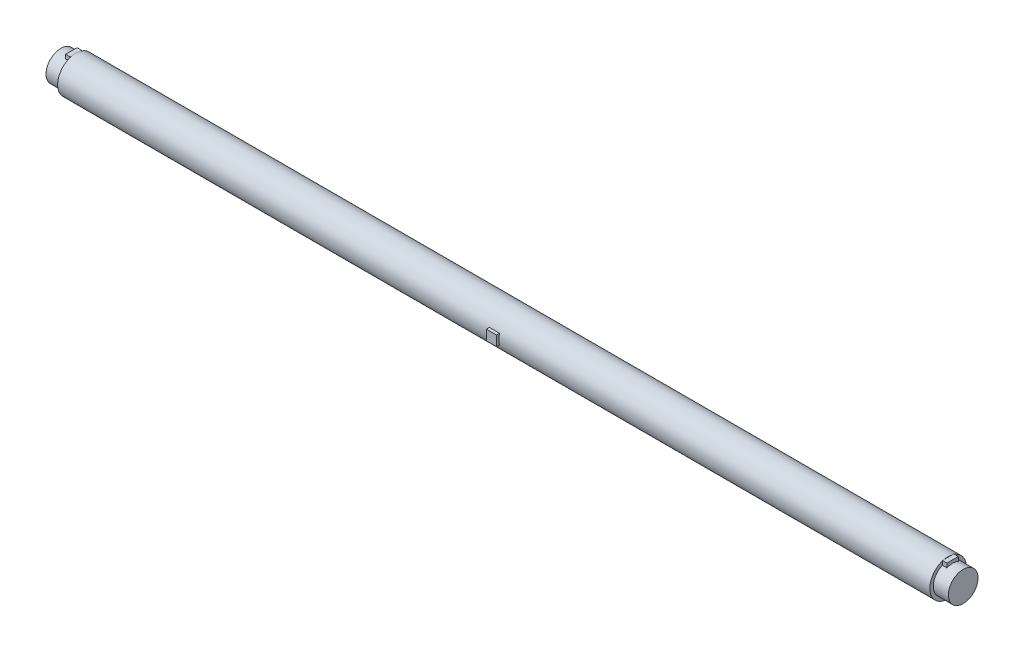
ISO-10303-21;
HEADER;
FILE_DESCRIPTION(('STEP AP214'),'2;1');
FILE_NAME('part.step','',(''),(''),'','','');
FILE_SCHEMA(('AUTOMOTIVE_DESIGN { 1 0 10303 214 1 1 1 1 }'));
ENDSEC;
DATA;
#1=APPLICATION_CONTEXT('core data for automotive mechanical design processes');
#2=APPLICATION_PROTOCOL_DEFINITION('international standard','automotive_design',2000,#1);
#3=PRODUCT_CONTEXT('',#1,'mechanical');
#4=PRODUCT('Part','Part','',(#3));
#5=PRODUCT_RELATED_PRODUCT_CATEGORY('part','',(#4));
#6=PRODUCT_DEFINITION_FORMATION('','',#4);
#7=PRODUCT_DEFINITION_CONTEXT('part definition',#1,'design');
#8=PRODUCT_DEFINITION('design','',#6,#7);
#9=PRODUCT_DEFINITION_SHAPE('','',#8);
#10=(LENGTH_UNIT() NAMED_UNIT(*) SI_UNIT(.MILLI.,.METRE.));
#11=(NAMED_UNIT(*) PLANE_ANGLE_UNIT() SI_UNIT($,.RADIAN.));
#12=(NAMED_UNIT(*) SI_UNIT($,.STERADIAN.) SOLID_ANGLE_UNIT());
#13=UNCERTAINTY_MEASURE_WITH_UNIT(LENGTH_MEASURE(1.E-05),#10,'distance_accuracy_value','');
#14=(GEOMETRIC_REPRESENTATION_CONTEXT(3) GLOBAL_UNCERTAINTY_ASSIGNED_CONTEXT((#13)) GLOBAL_UNIT_ASSIGNED_CONTEXT((#10,
#11,#12)) REPRESENTATION_CONTEXT('',''));
#15=CARTESIAN_POINT('',(0.,0.,0.));
#16=DIRECTION('',(0.,0.,1.));
#17=DIRECTION('',(1.,0.,0.));
#18=AXIS2_PLACEMENT_3D('',#15,#16,#17);
#19=CARTESIAN_POINT('',(955.,40.,0.));
#20=DIRECTION('',(1.,0.,0.));
#21=DIRECTION('',(0.,1.,0.));
#22=AXIS2_PLACEMENT_3D('',#19,#20,#21);
#23=PLANE('',#22);
#24=DIRECTION('',(0.,1.,0.));
#25=VECTOR('',#24,1.);
#26=CARTESIAN_POINT('',(955.,30.0000000000002,12.5));
#27=LINE('',#26,#25);
#28=CARTESIAN_POINT('',(955.,30.0000000000002,12.5));
#29=VERTEX_POINT('',#28);
#30=CARTESIAN_POINT('',(955.,37.9967103839266,12.5));
#31=VERTEX_POINT('',#30);
#32=EDGE_CURVE('E191',#29,#31,#27,.T.);
#33=ORIENTED_EDGE('',*,*,#32,.T.);
#34=CARTESIAN_POINT('',(955.,2.37948873074331E-13,0.));
#35=DIRECTION('',(1.,0.,0.));
#36=DIRECTION('',(0.,1.,0.));
#37=AXIS2_PLACEMENT_3D('',#34,#35,#36);
#38=CIRCLE('',#37,39.9999999999998);
#39=CARTESIAN_POINT('',(955.,37.9967103839266,-12.5));
#40=VERTEX_POINT('',#39);
#41=EDGE_CURVE('E309',#31,#40,#38,.T.);
#42=ORIENTED_EDGE('',*,*,#41,.T.);
#43=DIRECTION('',(0.,-1.,0.));
#44=VECTOR('',#43,1.);
#45=CARTESIAN_POINT('',(955.,30.0000000000002,-12.5));
#46=LINE('',#45,#44);
#47=CARTESIAN_POINT('',(955.,30.0000000000002,-12.5));
#48=VERTEX_POINT('',#47);
#49=EDGE_CURVE('E194',#40,#48,#46,.T.);
#50=ORIENTED_EDGE('',*,*,#49,.T.);
#51=CARTESIAN_POINT('',(955.,2.37948873074331E-13,0.));
#52=DIRECTION('',(1.,0.,0.));
#53=DIRECTION('',(0.,1.,0.));
#54=AXIS2_PLACEMENT_3D('',#51,#52,#53);
#55=CIRCLE('',#54,32.5);
#56=EDGE_CURVE('E161',#29,#48,#55,.T.);
#57=ORIENTED_EDGE('',*,*,#56,.F.);
#58=EDGE_LOOP('',(#33,#42,#50,#57));
#59=FACE_BOUND('',#58,.T.);
#60=ADVANCED_FACE('F39',(#59),#23,.T.);
#61=CARTESIAN_POINT('',(988.,2.41990207511517E-13,0.));
#62=DIRECTION('',(1.,0.,0.));
#63=DIRECTION('',(0.,1.,0.));
#64=AXIS2_PLACEMENT_3D('',#61,#62,#63);
#65=CYLINDRICAL_SURFACE('',#64,32.5);
#66=CARTESIAN_POINT('',(-988.,0.,0.));
#67=DIRECTION('',(1.,0.,0.));
#68=DIRECTION('',(0.,1.,0.));
#69=AXIS2_PLACEMENT_3D('',#66,#67,#68);
#70=CIRCLE('',#69,32.5);
#71=CARTESIAN_POINT('',(-988.,32.5,0.));
#72=VERTEX_POINT('',#71);
#73=EDGE_CURVE('E11',#72,#72,#70,.T.);
#74=ORIENTED_EDGE('',*,*,#73,.T.);
#75=EDGE_LOOP('',(#74));
#76=FACE_BOUND('',#75,.T.);
#77=CARTESIAN_POINT('',(-955.,0.,0.));
#78=DIRECTION('',(1.,0.,0.));
#79=DIRECTION('',(0.,1.,0.));
#80=AXIS2_PLACEMENT_3D('',#77,#78,#79);
#81=CIRCLE('',#80,32.5);
#82=CARTESIAN_POINT('',(-955.,30.,12.5));
#83=VERTEX_POINT('',#82);
#84=CARTESIAN_POINT('',(-955.,30.,-12.5));
#85=VERTEX_POINT('',#84);
#86=EDGE_CURVE('E48',#83,#85,#81,.T.);
#87=ORIENTED_EDGE('',*,*,#86,.F.);
#88=DIRECTION('',(1.,0.,0.));
#89=VECTOR('',#88,1.);
#90=CARTESIAN_POINT('',(-965.,30.,12.5));
#91=LINE('',#90,#89);
#92=CARTESIAN_POINT('',(-965.,30.,12.5));
#93=VERTEX_POINT('',#92);
#94=EDGE_CURVE('E229',#93,#83,#91,.T.);
#95=ORIENTED_EDGE('',*,*,#94,.F.);
#96=CARTESIAN_POINT('',(-965.,0.,0.));
#97=DIRECTION('',(1.,0.,0.));
#98=DIRECTION('',(0.,-1.,0.));
#99=AXIS2_PLACEMENT_3D('',#96,#97,#98);
#100=CIRCLE('',#99,32.5);
#101=CARTESIAN_POINT('',(-965.,30.,-12.5));
#102=VERTEX_POINT('',#101);
#103=EDGE_CURVE('E226',#102,#93,#100,.T.);
#104=ORIENTED_EDGE('',*,*,#103,.F.);
#105=DIRECTION('',(1.,0.,0.));
#106=VECTOR('',#105,1.);
#107=CARTESIAN_POINT('',(-965.,30.,-12.5));
#108=LINE('',#107,#106);
#109=EDGE_CURVE('E245',#102,#85,#108,.T.);
#110=ORIENTED_EDGE('',*,*,#109,.T.);
#111=EDGE_LOOP('',(#87,#95,#104,#110));
#112=FACE_BOUND('',#111,.T.);
#113=ADVANCED_FACE('F325',(#76,#112),#65,.T.);
#114=CARTESIAN_POINT('',(-955.,32.5,0.));
#115=DIRECTION('',(-1.,0.,0.));
#116=DIRECTION('',(0.,-1.,0.));
#117=AXIS2_PLACEMENT_3D('',#114,#115,#116);
#118=PLANE('',#117);
#119=CARTESIAN_POINT('',(-955.,0.,0.));
#120=DIRECTION('',(1.,0.,0.));
#121=DIRECTION('',(0.,1.,0.));
#122=AXIS2_PLACEMENT_3D('',#119,#120,#121);
#123=CIRCLE('',#122,40.);
#124=CARTESIAN_POINT('',(-955.,37.9967103839266,12.5));
#125=VERTEX_POINT('',#124);
#126=CARTESIAN_POINT('',(-955.,37.9967103839265,-12.5));
#127=VERTEX_POINT('',#126);
#128=EDGE_CURVE('E313',#125,#127,#123,.T.);
#129=ORIENTED_EDGE('',*,*,#128,.F.);
#130=DIRECTION('',(0.,1.,0.));
#131=VECTOR('',#130,1.);
#132=CARTESIAN_POINT('',(-955.,30.,12.5));
#133=LINE('',#132,#131);
#134=EDGE_CURVE('E230',#83,#125,#133,.T.);
#135=ORIENTED_EDGE('',*,*,#134,.F.);
#136=ORIENTED_EDGE('',*,*,#86,.T.);
#137=DIRECTION('',(0.,-1.,0.));
#138=VECTOR('',#137,1.);
#139=CARTESIAN_POINT('',(-955.,30.,-12.5));
#140=LINE('',#139,#138);
#141=EDGE_CURVE('E238',#127,#85,#140,.T.);
#142=ORIENTED_EDGE('',*,*,#141,.F.);
#143=EDGE_LOOP('',(#129,#135,#136,#142));
#144=FACE_BOUND('',#143,.T.);
#145=ADVANCED_FACE('F321',(#144),#118,.T.);
#146=CARTESIAN_POINT('',(-955.,39.13,-8.29717421776783));
#147=VERTEX_POINT('',#146);
#148=CARTESIAN_POINT('',(-955.,39.13,8.29717421776783));
#149=VERTEX_POINT('',#148);
#150=EDGE_CURVE('E308',#147,#149,#123,.T.);
#151=ORIENTED_EDGE('',*,*,#150,.F.);
#152=DIRECTION('',(0.,0.,-1.));
#153=VECTOR('',#152,1.);
#154=CARTESIAN_POINT('',(-955.,39.13,-12.5));
#155=LINE('',#154,#153);
#156=EDGE_CURVE('E239',#149,#147,#155,.T.);
#157=ORIENTED_EDGE('',*,*,#156,.F.);
#158=EDGE_LOOP('',(#151,#157));
#159=FACE_BOUND('',#158,.T.);
#160=ADVANCED_FACE('F383',(#159),#118,.T.);
#161=CARTESIAN_POINT('',(-988.,0.,0.));
#162=DIRECTION('',(-1.,0.,0.));
#163=DIRECTION('',(0.,-1.,0.));
#164=AXIS2_PLACEMENT_3D('',#161,#162,#163);
#165=PLANE('',#164);
#166=ORIENTED_EDGE('',*,*,#73,.F.);
#167=EDGE_LOOP('',(#166));
#168=FACE_BOUND('',#167,.T.);
#169=ADVANCED_FACE('F41',(#168),#165,.T.);
#170=CARTESIAN_POINT('',(988.,2.41990207511517E-13,0.));
#171=DIRECTION('',(1.,0.,0.));
#172=DIRECTION('',(0.,1.,0.));
#173=AXIS2_PLACEMENT_3D('',#170,#171,#172);
#174=CYLINDRICAL_SURFACE('',#173,39.9999999999999);
#175=DIRECTION('',(1.,0.,0.));
#176=VECTOR('',#175,1.);
#177=CARTESIAN_POINT('',(988.,-11.,38.4577690460586));
#178=LINE('',#177,#176);
#179=CARTESIAN_POINT('',(11.18,-11.,38.4577690460587));
#180=VERTEX_POINT('',#179);
#181=CARTESIAN_POINT('',(-11.18,-11.0000000000001,38.4577690460586));
#182=VERTEX_POINT('',#181);
#183=EDGE_CURVE('E268',#180,#182,#178,.F.);
#184=ORIENTED_EDGE('',*,*,#183,.T.);
#185=CARTESIAN_POINT('',(-11.18,1.19625948634312E-13,0.));
#186=DIRECTION('',(-1.,0.,0.));
#187=DIRECTION('',(0.,-1.,0.));
#188=AXIS2_PLACEMENT_3D('',#185,#186,#187);
#189=CIRCLE('',#188,39.9999999999999);
#190=CARTESIAN_POINT('',(-11.18,10.9999999999999,38.4577690460588));
#191=VERTEX_POINT('',#190);
#192=EDGE_CURVE('E265',#182,#191,#189,.T.);
#193=ORIENTED_EDGE('',*,*,#192,.T.);
#194=DIRECTION('',(1.,0.,0.));
#195=VECTOR('',#194,1.);
#196=CARTESIAN_POINT('',(988.,11.,38.4577690460588));
#197=LINE('',#196,#195);
#198=CARTESIAN_POINT('',(11.18,10.9999999999999,38.4577690460588));
#199=VERTEX_POINT('',#198);
#200=EDGE_CURVE('E261',#191,#199,#197,.T.);
#201=ORIENTED_EDGE('',*,*,#200,.T.);
#202=CARTESIAN_POINT('',(11.18,1.22364258877205E-13,0.));
#203=DIRECTION('',(1.,0.,0.));
#204=DIRECTION('',(0.,0.,-1.));
#205=AXIS2_PLACEMENT_3D('',#202,#203,#204);
#206=CIRCLE('',#205,39.9999999999999);
#207=EDGE_CURVE('E258',#199,#180,#206,.T.);
#208=ORIENTED_EDGE('',*,*,#207,.T.);
#209=EDGE_LOOP('',(#184,#193,#201,#208));
#210=FACE_BOUND('',#209,.T.);
#211=EDGE_CURVE('E310',#149,#125,#123,.T.);
#212=ORIENTED_EDGE('',*,*,#211,.T.);
#213=ORIENTED_EDGE('',*,*,#128,.T.);
#214=EDGE_CURVE('E398',#127,#147,#123,.T.);
#215=ORIENTED_EDGE('',*,*,#214,.T.);
#216=ORIENTED_EDGE('',*,*,#150,.T.);
#217=EDGE_LOOP('',(#212,#213,#215,#216));
#218=FACE_BOUND('',#217,.T.);
#219=CARTESIAN_POINT('',(955.,39.1300000000002,8.29717421776724));
#220=VERTEX_POINT('',#219);
#221=EDGE_CURVE('E304',#220,#31,#38,.T.);
#222=ORIENTED_EDGE('',*,*,#221,.F.);
#223=CARTESIAN_POINT('',(955.,39.1300000000002,-8.29717421776724));
#224=VERTEX_POINT('',#223);
#225=EDGE_CURVE('E303',#224,#220,#38,.T.);
#226=ORIENTED_EDGE('',*,*,#225,.F.);
#227=CARTESIAN_POINT('',(955.,2.37948873074331E-13,0.));
#228=DIRECTION('',(1.,0.,0.));
#229=DIRECTION('',(0.,1.,0.));
#230=AXIS2_PLACEMENT_3D('',#227,#228,#229);
#231=CIRCLE('',#230,39.9999999999999);
#232=EDGE_CURVE('E61',#224,#40,#231,.F.);
#233=ORIENTED_EDGE('',*,*,#232,.T.);
#234=ORIENTED_EDGE('',*,*,#41,.F.);
#235=EDGE_LOOP('',(#222,#226,#233,#234));
#236=FACE_BOUND('',#235,.T.);
#237=ADVANCED_FACE('F373',(#210,#218,#236),#174,.T.);
#238=DIRECTION('',(0.,0.,-1.));
#239=VECTOR('',#238,1.);
#240=CARTESIAN_POINT('',(955.,39.1300000000002,-12.5));
#241=LINE('',#240,#239);
#242=EDGE_CURVE('E54',#220,#224,#241,.T.);
#243=ORIENTED_EDGE('',*,*,#242,.T.);
#244=ORIENTED_EDGE('',*,*,#225,.T.);
#245=EDGE_LOOP('',(#243,#244));
#246=FACE_BOUND('',#245,.T.);
#247=ADVANCED_FACE('F365',(#246),#23,.T.);
#248=CARTESIAN_POINT('',(988.,2.41990207511517E-13,0.));
#249=DIRECTION('',(1.,0.,0.));
#250=DIRECTION('',(0.,1.,0.));
#251=AXIS2_PLACEMENT_3D('',#248,#249,#250);
#252=CYLINDRICAL_SURFACE('',#251,32.5);
#253=DIRECTION('',(-1.,0.,0.));
#254=VECTOR('',#253,1.);
#255=CARTESIAN_POINT('',(965.,30.0000000000002,12.5));
#256=LINE('',#255,#254);
#257=CARTESIAN_POINT('',(965.,30.0000000000002,12.5));
#258=VERTEX_POINT('',#257);
#259=EDGE_CURVE('E166',#258,#29,#256,.T.);
#260=ORIENTED_EDGE('',*,*,#259,.T.);
#261=ORIENTED_EDGE('',*,*,#56,.T.);
#262=DIRECTION('',(-1.,0.,0.));
#263=VECTOR('',#262,1.);
#264=CARTESIAN_POINT('',(965.,30.0000000000002,-12.5));
#265=LINE('',#264,#263);
#266=CARTESIAN_POINT('',(965.,30.0000000000002,-12.5));
#267=VERTEX_POINT('',#266);
#268=EDGE_CURVE('E154',#267,#48,#265,.T.);
#269=ORIENTED_EDGE('',*,*,#268,.F.);
#270=CARTESIAN_POINT('',(965.,2.39173519873478E-13,0.));
#271=DIRECTION('',(1.,0.,0.));
#272=DIRECTION('',(0.,-1.,0.));
#273=AXIS2_PLACEMENT_3D('',#270,#271,#272);
#274=CIRCLE('',#273,32.5);
#275=EDGE_CURVE('E158',#267,#258,#274,.T.);
#276=ORIENTED_EDGE('',*,*,#275,.T.);
#277=EDGE_LOOP('',(#260,#261,#269,#276));
#278=FACE_BOUND('',#277,.T.);
#279=CARTESIAN_POINT('',(988.,2.41990207511517E-13,0.));
#280=DIRECTION('',(1.,0.,0.));
#281=DIRECTION('',(0.,1.,0.));
#282=AXIS2_PLACEMENT_3D('',#279,#280,#281);
#283=CIRCLE('',#282,32.5);
#284=CARTESIAN_POINT('',(988.,32.5000000000002,0.));
#285=VERTEX_POINT('',#284);
#286=EDGE_CURVE('E297',#285,#285,#283,.T.);
#287=ORIENTED_EDGE('',*,*,#286,.F.);
#288=EDGE_LOOP('',(#287));
#289=FACE_BOUND('',#288,.T.);
#290=ADVANCED_FACE('F156',(#278,#289),#252,.T.);
#291=CARTESIAN_POINT('',(988.,32.5000000000002,0.));
#292=DIRECTION('',(1.,0.,0.));
#293=DIRECTION('',(0.,1.,0.));
#294=AXIS2_PLACEMENT_3D('',#291,#292,#293);
#295=PLANE('',#294);
#296=ORIENTED_EDGE('',*,*,#286,.T.);
#297=EDGE_LOOP('',(#296));
#298=FACE_BOUND('',#297,.T.);
#299=ADVANCED_FACE('F378',(#298),#295,.T.);
#300=CARTESIAN_POINT('',(0.,0.,45.1));
#301=DIRECTION('',(0.,0.,1.));
#302=DIRECTION('',(1.,0.,0.));
#303=AXIS2_PLACEMENT_3D('',#300,#301,#302);
#304=PLANE('',#303);
#305=DIRECTION('',(0.,-1.,0.));
#306=VECTOR('',#305,1.);
#307=CARTESIAN_POINT('',(-11.18,11.,45.1));
#308=LINE('',#307,#306);
#309=CARTESIAN_POINT('',(-11.18,11.,45.1));
#310=VERTEX_POINT('',#309);
#311=CARTESIAN_POINT('',(-11.18,-11.,45.1));
#312=VERTEX_POINT('',#311);
#313=EDGE_CURVE('E257',#310,#312,#308,.T.);
#314=ORIENTED_EDGE('',*,*,#313,.T.);
#315=DIRECTION('',(1.,0.,0.));
#316=VECTOR('',#315,1.);
#317=CARTESIAN_POINT('',(-11.18,-11.,45.1));
#318=LINE('',#317,#316);
#319=CARTESIAN_POINT('',(11.18,-11.,45.1));
#320=VERTEX_POINT('',#319);
#321=EDGE_CURVE('E272',#312,#320,#318,.T.);
#322=ORIENTED_EDGE('',*,*,#321,.T.);
#323=DIRECTION('',(0.,1.,0.));
#324=VECTOR('',#323,1.);
#325=CARTESIAN_POINT('',(11.18,11.,45.1));
#326=LINE('',#325,#324);
#327=CARTESIAN_POINT('',(11.18,11.,45.1));
#328=VERTEX_POINT('',#327);
#329=EDGE_CURVE('E276',#320,#328,#326,.T.);
#330=ORIENTED_EDGE('',*,*,#329,.T.);
#331=DIRECTION('',(-1.,0.,0.));
#332=VECTOR('',#331,1.);
#333=CARTESIAN_POINT('',(-11.18,11.,45.1));
#334=LINE('',#333,#332);
#335=EDGE_CURVE('E280',#328,#310,#334,.T.);
#336=ORIENTED_EDGE('',*,*,#335,.T.);
#337=EDGE_LOOP('',(#314,#322,#330,#336));
#338=FACE_BOUND('',#337,.T.);
#339=ADVANCED_FACE('F563',(#338),#304,.T.);
#340=CARTESIAN_POINT('',(-11.18,-11.,-40.001));
#341=DIRECTION('',(0.,-1.,0.));
#342=DIRECTION('',(0.,0.,-1.));
#343=AXIS2_PLACEMENT_3D('',#340,#341,#342);
#344=PLANE('',#343);
#345=ORIENTED_EDGE('',*,*,#183,.F.);
#346=DIRECTION('',(0.,0.,1.));
#347=VECTOR('',#346,1.);
#348=CARTESIAN_POINT('',(11.18,-11.,-40.001));
#349=LINE('',#348,#347);
#350=EDGE_CURVE('E290',#180,#320,#349,.T.);
#351=ORIENTED_EDGE('',*,*,#350,.T.);
#352=ORIENTED_EDGE('',*,*,#321,.F.);
#353=DIRECTION('',(0.,0.,1.));
#354=VECTOR('',#353,1.);
#355=CARTESIAN_POINT('',(-11.18,-11.,-40.001));
#356=LINE('',#355,#354);
#357=EDGE_CURVE('E284',#182,#312,#356,.T.);
#358=ORIENTED_EDGE('',*,*,#357,.F.);
#359=EDGE_LOOP('',(#345,#351,#352,#358));
#360=FACE_BOUND('',#359,.T.);
#361=ADVANCED_FACE('F553',(#360),#344,.T.);
#362=CARTESIAN_POINT('',(11.18,11.,-40.001));
#363=DIRECTION('',(1.,0.,0.));
#364=DIRECTION('',(0.,0.,-1.));
#365=AXIS2_PLACEMENT_3D('',#362,#363,#364);
#366=PLANE('',#365);
#367=ORIENTED_EDGE('',*,*,#207,.F.);
#368=DIRECTION('',(0.,0.,1.));
#369=VECTOR('',#368,1.);
#370=CARTESIAN_POINT('',(11.18,11.,-40.001));
#371=LINE('',#370,#369);
#372=EDGE_CURVE('E287',#199,#328,#371,.T.);
#373=ORIENTED_EDGE('',*,*,#372,.T.);
#374=ORIENTED_EDGE('',*,*,#329,.F.);
#375=ORIENTED_EDGE('',*,*,#350,.F.);
#376=EDGE_LOOP('',(#367,#373,#374,#375));
#377=FACE_BOUND('',#376,.T.);
#378=ADVANCED_FACE('F543',(#377),#366,.T.);
#379=CARTESIAN_POINT('',(-11.18,11.,-40.001));
#380=DIRECTION('',(0.,1.,0.));
#381=DIRECTION('',(0.,0.,1.));
#382=AXIS2_PLACEMENT_3D('',#379,#380,#381);
#383=PLANE('',#382);
#384=ORIENTED_EDGE('',*,*,#200,.F.);
#385=DIRECTION('',(0.,0.,1.));
#386=VECTOR('',#385,1.);
#387=CARTESIAN_POINT('',(-11.18,11.,-40.001));
#388=LINE('',#387,#386);
#389=EDGE_CURVE('E262',#191,#310,#388,.T.);
#390=ORIENTED_EDGE('',*,*,#389,.T.);
#391=ORIENTED_EDGE('',*,*,#335,.F.);
#392=ORIENTED_EDGE('',*,*,#372,.F.);
#393=EDGE_LOOP('',(#384,#390,#391,#392));
#394=FACE_BOUND('',#393,.T.);
#395=ADVANCED_FACE('F533',(#394),#383,.T.);
#396=CARTESIAN_POINT('',(-11.18,11.,-40.001));
#397=DIRECTION('',(-1.,0.,0.));
#398=DIRECTION('',(0.,-1.,0.));
#399=AXIS2_PLACEMENT_3D('',#396,#397,#398);
#400=PLANE('',#399);
#401=ORIENTED_EDGE('',*,*,#192,.F.);
#402=ORIENTED_EDGE('',*,*,#357,.T.);
#403=ORIENTED_EDGE('',*,*,#313,.F.);
#404=ORIENTED_EDGE('',*,*,#389,.F.);
#405=EDGE_LOOP('',(#401,#402,#403,#404));
#406=FACE_BOUND('',#405,.T.);
#407=ADVANCED_FACE('F510',(#406),#400,.T.);
#408=CARTESIAN_POINT('',(-955.,0.,0.));
#409=DIRECTION('',(-1.,0.,0.));
#410=DIRECTION('',(0.,-1.,0.));
#411=AXIS2_PLACEMENT_3D('',#408,#409,#410);
#412=PLANE('',#411);
#413=ORIENTED_EDGE('',*,*,#214,.F.);
#414=CARTESIAN_POINT('',(-955.,39.13,-12.5));
#415=VERTEX_POINT('',#414);
#416=EDGE_CURVE('E220',#415,#127,#140,.T.);
#417=ORIENTED_EDGE('',*,*,#416,.F.);
#418=EDGE_CURVE('E233',#147,#415,#155,.T.);
#419=ORIENTED_EDGE('',*,*,#418,.F.);
#420=EDGE_LOOP('',(#413,#417,#419));
#421=FACE_BOUND('',#420,.T.);
#422=ADVANCED_FACE('F359',(#421),#412,.F.);
#423=CARTESIAN_POINT('',(-965.,30.,12.5));
#424=DIRECTION('',(0.,0.,-1.));
#425=DIRECTION('',(-1.,0.,0.));
#426=AXIS2_PLACEMENT_3D('',#423,#424,#425);
#427=PLANE('',#426);
#428=ORIENTED_EDGE('',*,*,#134,.T.);
#429=CARTESIAN_POINT('',(-955.,39.13,12.5));
#430=VERTEX_POINT('',#429);
#431=EDGE_CURVE('E214',#125,#430,#133,.T.);
#432=ORIENTED_EDGE('',*,*,#431,.T.);
#433=DIRECTION('',(1.,0.,0.));
#434=VECTOR('',#433,1.);
#435=CARTESIAN_POINT('',(-965.,39.13,12.5));
#436=LINE('',#435,#434);
#437=CARTESIAN_POINT('',(-965.,39.13,12.5));
#438=VERTEX_POINT('',#437);
#439=EDGE_CURVE('E253',#438,#430,#436,.T.);
#440=ORIENTED_EDGE('',*,*,#439,.F.);
#441=DIRECTION('',(0.,1.,0.));
#442=VECTOR('',#441,1.);
#443=CARTESIAN_POINT('',(-965.,30.,12.5));
#444=LINE('',#443,#442);
#445=EDGE_CURVE('E215',#93,#438,#444,.T.);
#446=ORIENTED_EDGE('',*,*,#445,.F.);
#447=ORIENTED_EDGE('',*,*,#94,.T.);
#448=EDGE_LOOP('',(#428,#432,#440,#446,#447));
#449=FACE_BOUND('',#448,.T.);
#450=ADVANCED_FACE('F341',(#449),#427,.F.);
#451=CARTESIAN_POINT('',(-965.,39.13,-12.5));
#452=DIRECTION('',(0.,-1.,0.));
#453=DIRECTION('',(1.,0.,0.));
#454=AXIS2_PLACEMENT_3D('',#451,#452,#453);
#455=PLANE('',#454);
#456=EDGE_CURVE('E234',#430,#149,#155,.T.);
#457=ORIENTED_EDGE('',*,*,#456,.T.);
#458=ORIENTED_EDGE('',*,*,#156,.T.);
#459=ORIENTED_EDGE('',*,*,#418,.T.);
#460=DIRECTION('',(1.,0.,0.));
#461=VECTOR('',#460,1.);
#462=CARTESIAN_POINT('',(-965.,39.13,-12.5));
#463=LINE('',#462,#461);
#464=CARTESIAN_POINT('',(-965.,39.13,-12.5));
#465=VERTEX_POINT('',#464);
#466=EDGE_CURVE('E249',#465,#415,#463,.T.);
#467=ORIENTED_EDGE('',*,*,#466,.F.);
#468=DIRECTION('',(0.,0.,-1.));
#469=VECTOR('',#468,1.);
#470=CARTESIAN_POINT('',(-965.,39.13,-12.5));
#471=LINE('',#470,#469);
#472=EDGE_CURVE('E219',#438,#465,#471,.T.);
#473=ORIENTED_EDGE('',*,*,#472,.F.);
#474=ORIENTED_EDGE('',*,*,#439,.T.);
#475=EDGE_LOOP('',(#457,#458,#459,#467,#473,#474));
#476=FACE_BOUND('',#475,.T.);
#477=ADVANCED_FACE('F347',(#476),#455,.F.);
#478=CARTESIAN_POINT('',(-965.,30.,-12.5));
#479=DIRECTION('',(0.,0.,1.));
#480=DIRECTION('',(1.,0.,0.));
#481=AXIS2_PLACEMENT_3D('',#478,#479,#480);
#482=PLANE('',#481);
#483=ORIENTED_EDGE('',*,*,#416,.T.);
#484=ORIENTED_EDGE('',*,*,#141,.T.);
#485=ORIENTED_EDGE('',*,*,#109,.F.);
#486=DIRECTION('',(0.,-1.,0.));
#487=VECTOR('',#486,1.);
#488=CARTESIAN_POINT('',(-965.,30.,-12.5));
#489=LINE('',#488,#487);
#490=EDGE_CURVE('E223',#465,#102,#489,.T.);
#491=ORIENTED_EDGE('',*,*,#490,.F.);
#492=ORIENTED_EDGE('',*,*,#466,.T.);
#493=EDGE_LOOP('',(#483,#484,#485,#491,#492));
#494=FACE_BOUND('',#493,.T.);
#495=ADVANCED_FACE('F330',(#494),#482,.F.);
#496=CARTESIAN_POINT('',(-965.,0.,0.));
#497=DIRECTION('',(-1.,0.,0.));
#498=DIRECTION('',(0.,-1.,0.));
#499=AXIS2_PLACEMENT_3D('',#496,#497,#498);
#500=PLANE('',#499);
#501=ORIENTED_EDGE('',*,*,#445,.T.);
#502=ORIENTED_EDGE('',*,*,#472,.T.);
#503=ORIENTED_EDGE('',*,*,#490,.T.);
#504=ORIENTED_EDGE('',*,*,#103,.T.);
#505=EDGE_LOOP('',(#501,#502,#503,#504));
#506=FACE_BOUND('',#505,.T.);
#507=ADVANCED_FACE('F350',(#506),#500,.T.);
#508=ORIENTED_EDGE('',*,*,#211,.F.);
#509=ORIENTED_EDGE('',*,*,#456,.F.);
#510=ORIENTED_EDGE('',*,*,#431,.F.);
#511=EDGE_LOOP('',(#508,#509,#510));
#512=FACE_BOUND('',#511,.T.);
#513=ADVANCED_FACE('F344',(#512),#412,.F.);
#514=CARTESIAN_POINT('',(955.,2.37948873074331E-13,0.));
#515=DIRECTION('',(1.,0.,0.));
#516=DIRECTION('',(0.,-1.,0.));
#517=AXIS2_PLACEMENT_3D('',#514,#515,#516);
#518=PLANE('',#517);
#519=ORIENTED_EDGE('',*,*,#232,.F.);
#520=CARTESIAN_POINT('',(955.,39.1300000000002,-12.5));
#521=VERTEX_POINT('',#520);
#522=EDGE_CURVE('E200',#224,#521,#241,.T.);
#523=ORIENTED_EDGE('',*,*,#522,.T.);
#524=EDGE_CURVE('E196',#521,#40,#46,.T.);
#525=ORIENTED_EDGE('',*,*,#524,.T.);
#526=EDGE_LOOP('',(#519,#523,#525));
#527=FACE_BOUND('',#526,.T.);
#528=ADVANCED_FACE('F357',(#527),#518,.F.);
#529=CARTESIAN_POINT('',(965.,30.0000000000002,12.5));
#530=DIRECTION('',(0.,0.,1.));
#531=DIRECTION('',(1.,0.,0.));
#532=AXIS2_PLACEMENT_3D('',#529,#530,#531);
#533=PLANE('',#532);
#534=ORIENTED_EDGE('',*,*,#32,.F.);
#535=ORIENTED_EDGE('',*,*,#259,.F.);
#536=DIRECTION('',(0.,1.,0.));
#537=VECTOR('',#536,1.);
#538=CARTESIAN_POINT('',(965.,30.0000000000002,12.5));
#539=LINE('',#538,#537);
#540=CARTESIAN_POINT('',(965.,39.1300000000002,12.5));
#541=VERTEX_POINT('',#540);
#542=EDGE_CURVE('E177',#258,#541,#539,.T.);
#543=ORIENTED_EDGE('',*,*,#542,.T.);
#544=DIRECTION('',(-1.,0.,0.));
#545=VECTOR('',#544,1.);
#546=CARTESIAN_POINT('',(965.,39.1300000000002,12.5));
#547=LINE('',#546,#545);
#548=CARTESIAN_POINT('',(955.,39.1300000000002,12.5));
#549=VERTEX_POINT('',#548);
#550=EDGE_CURVE('E187',#541,#549,#547,.T.);
#551=ORIENTED_EDGE('',*,*,#550,.T.);
#552=EDGE_CURVE('E195',#31,#549,#27,.T.);
#553=ORIENTED_EDGE('',*,*,#552,.F.);
#554=EDGE_LOOP('',(#534,#535,#543,#551,#553));
#555=FACE_BOUND('',#554,.T.);
#556=ADVANCED_FACE('F416',(#555),#533,.T.);
#557=CARTESIAN_POINT('',(965.,30.0000000000002,-12.5));
#558=DIRECTION('',(0.,0.,-1.));
#559=DIRECTION('',(-1.,0.,0.));
#560=AXIS2_PLACEMENT_3D('',#557,#558,#559);
#561=PLANE('',#560);
#562=ORIENTED_EDGE('',*,*,#524,.F.);
#563=DIRECTION('',(-1.,0.,0.));
#564=VECTOR('',#563,1.);
#565=CARTESIAN_POINT('',(965.,39.1300000000002,-12.5));
#566=LINE('',#565,#564);
#567=CARTESIAN_POINT('',(965.,39.1300000000002,-12.5));
#568=VERTEX_POINT('',#567);
#569=EDGE_CURVE('E167',#568,#521,#566,.T.);
#570=ORIENTED_EDGE('',*,*,#569,.F.);
#571=DIRECTION('',(0.,-1.,0.));
#572=VECTOR('',#571,1.);
#573=CARTESIAN_POINT('',(965.,30.0000000000002,-12.5));
#574=LINE('',#573,#572);
#575=EDGE_CURVE('E174',#568,#267,#574,.T.);
#576=ORIENTED_EDGE('',*,*,#575,.T.);
#577=ORIENTED_EDGE('',*,*,#268,.T.);
#578=ORIENTED_EDGE('',*,*,#49,.F.);
#579=EDGE_LOOP('',(#562,#570,#576,#577,#578));
#580=FACE_BOUND('',#579,.T.);
#581=ADVANCED_FACE('F181',(#580),#561,.T.);
#582=CARTESIAN_POINT('',(965.,39.1300000000002,-12.5));
#583=DIRECTION('',(0.,1.,0.));
#584=DIRECTION('',(-1.,0.,0.));
#585=AXIS2_PLACEMENT_3D('',#582,#583,#584);
#586=PLANE('',#585);
#587=EDGE_CURVE('E201',#549,#220,#241,.T.);
#588=ORIENTED_EDGE('',*,*,#587,.F.);
#589=ORIENTED_EDGE('',*,*,#550,.F.);
#590=DIRECTION('',(0.,0.,-1.));
#591=VECTOR('',#590,1.);
#592=CARTESIAN_POINT('',(965.,39.1300000000002,-12.5));
#593=LINE('',#592,#591);
#594=EDGE_CURVE('E184',#541,#568,#593,.T.);
#595=ORIENTED_EDGE('',*,*,#594,.T.);
#596=ORIENTED_EDGE('',*,*,#569,.T.);
#597=ORIENTED_EDGE('',*,*,#522,.F.);
#598=ORIENTED_EDGE('',*,*,#242,.F.);
#599=EDGE_LOOP('',(#588,#589,#595,#596,#597,#598));
#600=FACE_BOUND('',#599,.T.);
#601=ADVANCED_FACE('F410',(#600),#586,.T.);
#602=CARTESIAN_POINT('',(965.,2.39173519873478E-13,0.));
#603=DIRECTION('',(1.,0.,0.));
#604=DIRECTION('',(0.,-1.,0.));
#605=AXIS2_PLACEMENT_3D('',#602,#603,#604);
#606=PLANE('',#605);
#607=ORIENTED_EDGE('',*,*,#542,.F.);
#608=ORIENTED_EDGE('',*,*,#275,.F.);
#609=ORIENTED_EDGE('',*,*,#575,.F.);
#610=ORIENTED_EDGE('',*,*,#594,.F.);
#611=EDGE_LOOP('',(#607,#608,#609,#610));
#612=FACE_BOUND('',#611,.T.);
#613=ADVANCED_FACE('F172',(#612),#606,.T.);
#614=ORIENTED_EDGE('',*,*,#221,.T.);
#615=ORIENTED_EDGE('',*,*,#552,.T.);
#616=ORIENTED_EDGE('',*,*,#587,.T.);
#617=EDGE_LOOP('',(#614,#615,#616));
#618=FACE_BOUND('',#617,.T.);
#619=ADVANCED_FACE('F412',(#618),#518,.F.);
#620=CLOSED_SHELL('',(#60,#113,#145,#160,#169,#237,#247,#290,#299,#339,#361,#378,#395,#407,#422,
#450,#477,#495,#507,#513,#528,#556,#581,#601,#613,#619));
#621=MANIFOLD_SOLID_BREP('B2',#620);
#622=ADVANCED_BREP_SHAPE_REPRESENTATION('',(#18,#621),#14);
#623=SHAPE_DEFINITION_REPRESENTATION(#9,#622);
ENDSEC;
END-ISO-10303-21;
